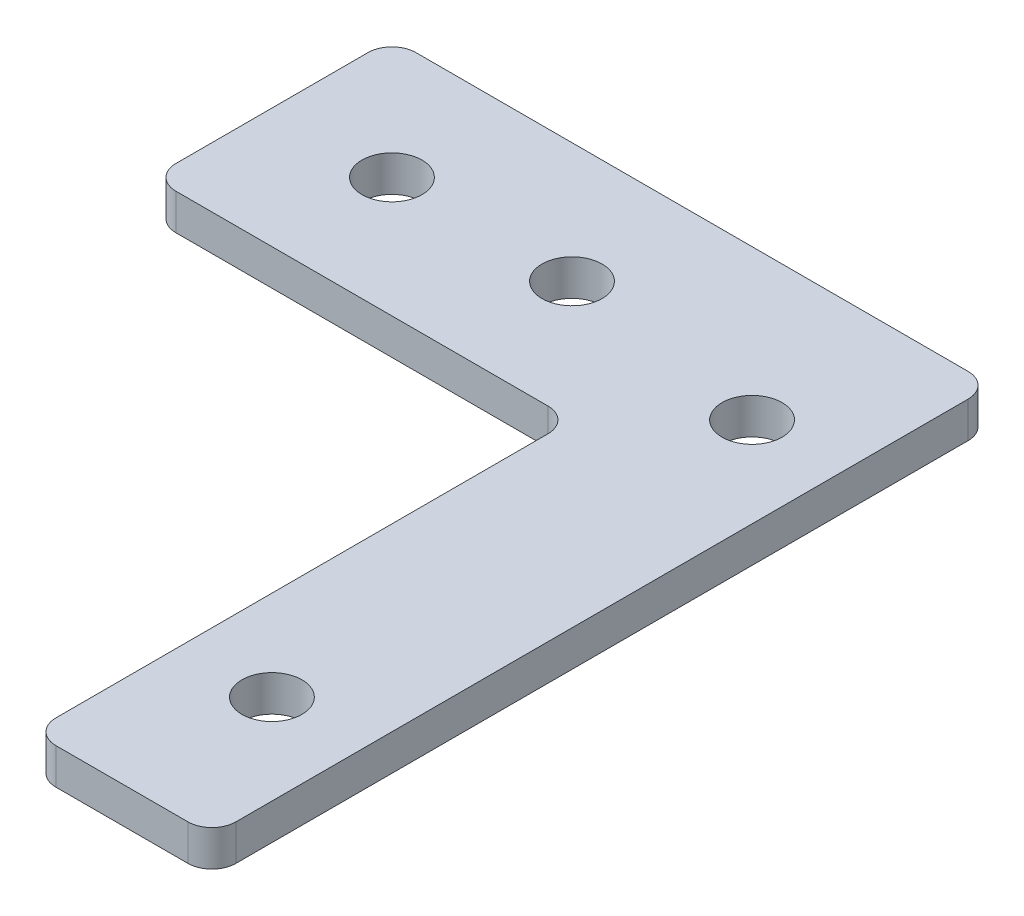
ISO-10303-21;
HEADER;
FILE_DESCRIPTION(('STEP AP214'),'2;1');
FILE_NAME('part.step','',(''),(''),'','','');
FILE_SCHEMA(('AUTOMOTIVE_DESIGN { 1 0 10303 214 1 1 1 1 }'));
ENDSEC;
DATA;
#1=APPLICATION_CONTEXT('core data for automotive mechanical design processes');
#2=APPLICATION_PROTOCOL_DEFINITION('international standard','automotive_design',2000,#1);
#3=PRODUCT_CONTEXT('',#1,'mechanical');
#4=PRODUCT('Part','Part','',(#3));
#5=PRODUCT_RELATED_PRODUCT_CATEGORY('part','',(#4));
#6=PRODUCT_DEFINITION_FORMATION('','',#4);
#7=PRODUCT_DEFINITION_CONTEXT('part definition',#1,'design');
#8=PRODUCT_DEFINITION('design','',#6,#7);
#9=PRODUCT_DEFINITION_SHAPE('','',#8);
#10=(LENGTH_UNIT() NAMED_UNIT(*) SI_UNIT(.MILLI.,.METRE.));
#11=(NAMED_UNIT(*) PLANE_ANGLE_UNIT() SI_UNIT($,.RADIAN.));
#12=(NAMED_UNIT(*) SI_UNIT($,.STERADIAN.) SOLID_ANGLE_UNIT());
#13=UNCERTAINTY_MEASURE_WITH_UNIT(LENGTH_MEASURE(1.E-05),#10,'distance_accuracy_value','');
#14=(GEOMETRIC_REPRESENTATION_CONTEXT(3) GLOBAL_UNCERTAINTY_ASSIGNED_CONTEXT((#13)) GLOBAL_UNIT_ASSIGNED_CONTEXT((#10,
#11,#12)) REPRESENTATION_CONTEXT('',''));
#15=CARTESIAN_POINT('',(0.,0.,0.));
#16=DIRECTION('',(0.,0.,1.));
#17=DIRECTION('',(1.,0.,0.));
#18=AXIS2_PLACEMENT_3D('',#15,#16,#17);
#19=CARTESIAN_POINT('',(0.,3.,-20.));
#20=DIRECTION('',(0.,0.,-1.));
#21=DIRECTION('',(-1.,0.,0.));
#22=AXIS2_PLACEMENT_3D('',#19,#20,#21);
#23=PLANE('',#22);
#24=DIRECTION('',(1.,0.,0.));
#25=VECTOR('',#24,1.);
#26=CARTESIAN_POINT('',(0.,0.,-20.));
#27=LINE('',#26,#25);
#28=CARTESIAN_POINT('',(2.00000000000001,0.,-20.));
#29=VERTEX_POINT('',#28);
#30=CARTESIAN_POINT('',(48.,0.,-20.));
#31=VERTEX_POINT('',#30);
#32=EDGE_CURVE('E167',#29,#31,#27,.T.);
#33=ORIENTED_EDGE('',*,*,#32,.F.);
#34=DIRECTION('',(0.,-1.,0.));
#35=VECTOR('',#34,1.);
#36=CARTESIAN_POINT('',(2.00000000000001,3.,-20.));
#37=LINE('',#36,#35);
#38=CARTESIAN_POINT('',(2.00000000000001,3.,-20.));
#39=VERTEX_POINT('',#38);
#40=EDGE_CURVE('E11',#39,#29,#37,.T.);
#41=ORIENTED_EDGE('',*,*,#40,.F.);
#42=DIRECTION('',(1.,0.,0.));
#43=VECTOR('',#42,1.);
#44=CARTESIAN_POINT('',(0.,3.,-20.));
#45=LINE('',#44,#43);
#46=CARTESIAN_POINT('',(48.,3.,-20.));
#47=VERTEX_POINT('',#46);
#48=EDGE_CURVE('E239',#39,#47,#45,.T.);
#49=ORIENTED_EDGE('',*,*,#48,.T.);
#50=DIRECTION('',(0.,-1.,0.));
#51=VECTOR('',#50,1.);
#52=CARTESIAN_POINT('',(48.,3.,-20.));
#53=LINE('',#52,#51);
#54=EDGE_CURVE('E100',#47,#31,#53,.T.);
#55=ORIENTED_EDGE('',*,*,#54,.T.);
#56=EDGE_LOOP('',(#33,#41,#49,#55));
#57=FACE_BOUND('',#56,.T.);
#58=ADVANCED_FACE('F37',(#57),#23,.T.);
#59=CARTESIAN_POINT('',(2.,3.,-18.));
#60=DIRECTION('',(0.,-1.,0.));
#61=DIRECTION('',(0.,0.,-1.));
#62=AXIS2_PLACEMENT_3D('',#59,#60,#61);
#63=CYLINDRICAL_SURFACE('',#62,2.);
#64=CARTESIAN_POINT('',(2.,0.,-18.));
#65=DIRECTION('',(0.,1.,0.));
#66=DIRECTION('',(0.,0.,1.));
#67=AXIS2_PLACEMENT_3D('',#64,#65,#66);
#68=CIRCLE('',#67,2.);
#69=CARTESIAN_POINT('',(0.,0.,-18.));
#70=VERTEX_POINT('',#69);
#71=EDGE_CURVE('E170',#29,#70,#68,.T.);
#72=ORIENTED_EDGE('',*,*,#71,.T.);
#73=DIRECTION('',(0.,-1.,0.));
#74=VECTOR('',#73,1.);
#75=CARTESIAN_POINT('',(0.,3.,-18.));
#76=LINE('',#75,#74);
#77=CARTESIAN_POINT('',(0.,3.,-18.));
#78=VERTEX_POINT('',#77);
#79=EDGE_CURVE('E46',#78,#70,#76,.T.);
#80=ORIENTED_EDGE('',*,*,#79,.F.);
#81=CARTESIAN_POINT('',(2.,3.,-18.));
#82=DIRECTION('',(0.,1.,0.));
#83=DIRECTION('',(0.,0.,1.));
#84=AXIS2_PLACEMENT_3D('',#81,#82,#83);
#85=CIRCLE('',#84,2.);
#86=EDGE_CURVE('E235',#39,#78,#85,.T.);
#87=ORIENTED_EDGE('',*,*,#86,.F.);
#88=ORIENTED_EDGE('',*,*,#40,.T.);
#89=EDGE_LOOP('',(#72,#80,#87,#88));
#90=FACE_BOUND('',#89,.T.);
#91=ADVANCED_FACE('F224',(#90),#63,.T.);
#92=CARTESIAN_POINT('',(0.,3.,0.));
#93=DIRECTION('',(-1.,0.,0.));
#94=DIRECTION('',(0.,0.,1.));
#95=AXIS2_PLACEMENT_3D('',#92,#93,#94);
#96=PLANE('',#95);
#97=DIRECTION('',(0.,0.,-1.));
#98=VECTOR('',#97,1.);
#99=CARTESIAN_POINT('',(0.,0.,0.));
#100=LINE('',#99,#98);
#101=CARTESIAN_POINT('',(0.,0.,-2.00000000000001));
#102=VERTEX_POINT('',#101);
#103=EDGE_CURVE('E173',#102,#70,#100,.T.);
#104=ORIENTED_EDGE('',*,*,#103,.F.);
#105=DIRECTION('',(0.,-1.,0.));
#106=VECTOR('',#105,1.);
#107=CARTESIAN_POINT('',(0.,3.,-2.00000000000001));
#108=LINE('',#107,#106);
#109=CARTESIAN_POINT('',(0.,3.,-2.00000000000001));
#110=VERTEX_POINT('',#109);
#111=EDGE_CURVE('E214',#110,#102,#108,.T.);
#112=ORIENTED_EDGE('',*,*,#111,.F.);
#113=DIRECTION('',(0.,0.,-1.));
#114=VECTOR('',#113,1.);
#115=CARTESIAN_POINT('',(0.,3.,0.));
#116=LINE('',#115,#114);
#117=EDGE_CURVE('E221',#110,#78,#116,.T.);
#118=ORIENTED_EDGE('',*,*,#117,.T.);
#119=ORIENTED_EDGE('',*,*,#79,.T.);
#120=EDGE_LOOP('',(#104,#112,#118,#119));
#121=FACE_BOUND('',#120,.T.);
#122=ADVANCED_FACE('F219',(#121),#96,.T.);
#123=CARTESIAN_POINT('',(2.,3.,-2.));
#124=DIRECTION('',(0.,-1.,0.));
#125=DIRECTION('',(0.,0.,-1.));
#126=AXIS2_PLACEMENT_3D('',#123,#124,#125);
#127=CYLINDRICAL_SURFACE('',#126,2.);
#128=CARTESIAN_POINT('',(2.,0.,-2.));
#129=DIRECTION('',(0.,1.,0.));
#130=DIRECTION('',(0.,0.,1.));
#131=AXIS2_PLACEMENT_3D('',#128,#129,#130);
#132=CIRCLE('',#131,2.);
#133=CARTESIAN_POINT('',(2.00000000000001,0.,0.));
#134=VERTEX_POINT('',#133);
#135=EDGE_CURVE('E176',#134,#102,#132,.F.);
#136=ORIENTED_EDGE('',*,*,#135,.F.);
#137=DIRECTION('',(0.,-1.,0.));
#138=VECTOR('',#137,1.);
#139=CARTESIAN_POINT('',(2.00000000000001,3.,0.));
#140=LINE('',#139,#138);
#141=CARTESIAN_POINT('',(2.00000000000001,3.,0.));
#142=VERTEX_POINT('',#141);
#143=EDGE_CURVE('E212',#142,#134,#140,.T.);
#144=ORIENTED_EDGE('',*,*,#143,.F.);
#145=CARTESIAN_POINT('',(2.,3.,-2.));
#146=DIRECTION('',(0.,1.,0.));
#147=DIRECTION('',(0.,0.,1.));
#148=AXIS2_PLACEMENT_3D('',#145,#146,#147);
#149=CIRCLE('',#148,2.);
#150=EDGE_CURVE('E234',#142,#110,#149,.F.);
#151=ORIENTED_EDGE('',*,*,#150,.T.);
#152=ORIENTED_EDGE('',*,*,#111,.T.);
#153=EDGE_LOOP('',(#136,#144,#151,#152));
#154=FACE_BOUND('',#153,.T.);
#155=ADVANCED_FACE('F230',(#154),#127,.T.);
#156=CARTESIAN_POINT('',(0.,3.,0.));
#157=DIRECTION('',(0.,0.,-1.));
#158=DIRECTION('',(-1.,0.,0.));
#159=AXIS2_PLACEMENT_3D('',#156,#157,#158);
#160=PLANE('',#159);
#161=DIRECTION('',(1.,0.,0.));
#162=VECTOR('',#161,1.);
#163=CARTESIAN_POINT('',(0.,0.,0.));
#164=LINE('',#163,#162);
#165=CARTESIAN_POINT('',(33.,0.,0.));
#166=VERTEX_POINT('',#165);
#167=EDGE_CURVE('E179',#134,#166,#164,.T.);
#168=ORIENTED_EDGE('',*,*,#167,.T.);
#169=DIRECTION('',(0.,-1.,0.));
#170=VECTOR('',#169,1.);
#171=CARTESIAN_POINT('',(33.,3.,0.));
#172=LINE('',#171,#170);
#173=CARTESIAN_POINT('',(33.,3.,0.));
#174=VERTEX_POINT('',#173);
#175=EDGE_CURVE('E210',#174,#166,#172,.T.);
#176=ORIENTED_EDGE('',*,*,#175,.F.);
#177=DIRECTION('',(1.,0.,0.));
#178=VECTOR('',#177,1.);
#179=CARTESIAN_POINT('',(0.,3.,0.));
#180=LINE('',#179,#178);
#181=EDGE_CURVE('E237',#142,#174,#180,.T.);
#182=ORIENTED_EDGE('',*,*,#181,.F.);
#183=ORIENTED_EDGE('',*,*,#143,.T.);
#184=EDGE_LOOP('',(#168,#176,#182,#183));
#185=FACE_BOUND('',#184,.T.);
#186=ADVANCED_FACE('F338',(#185),#160,.F.);
#187=CARTESIAN_POINT('',(33.,3.,2.));
#188=DIRECTION('',(0.,-1.,0.));
#189=DIRECTION('',(0.,0.,-1.));
#190=AXIS2_PLACEMENT_3D('',#187,#188,#189);
#191=CYLINDRICAL_SURFACE('',#190,2.);
#192=CARTESIAN_POINT('',(33.,0.,2.));
#193=DIRECTION('',(0.,1.,0.));
#194=DIRECTION('',(0.,0.,1.));
#195=AXIS2_PLACEMENT_3D('',#192,#193,#194);
#196=CIRCLE('',#195,2.);
#197=CARTESIAN_POINT('',(35.,0.,2.00000000000002));
#198=VERTEX_POINT('',#197);
#199=EDGE_CURVE('E182',#198,#166,#196,.T.);
#200=ORIENTED_EDGE('',*,*,#199,.F.);
#201=DIRECTION('',(0.,-1.,0.));
#202=VECTOR('',#201,1.);
#203=CARTESIAN_POINT('',(35.,3.,2.00000000000002));
#204=LINE('',#203,#202);
#205=CARTESIAN_POINT('',(35.,3.,2.00000000000002));
#206=VERTEX_POINT('',#205);
#207=EDGE_CURVE('E208',#206,#198,#204,.T.);
#208=ORIENTED_EDGE('',*,*,#207,.F.);
#209=CARTESIAN_POINT('',(33.,3.,2.));
#210=DIRECTION('',(0.,1.,0.));
#211=DIRECTION('',(0.,0.,1.));
#212=AXIS2_PLACEMENT_3D('',#209,#210,#211);
#213=CIRCLE('',#212,2.);
#214=EDGE_CURVE('E244',#206,#174,#213,.T.);
#215=ORIENTED_EDGE('',*,*,#214,.T.);
#216=ORIENTED_EDGE('',*,*,#175,.T.);
#217=EDGE_LOOP('',(#200,#208,#215,#216));
#218=FACE_BOUND('',#217,.T.);
#219=ADVANCED_FACE('F334',(#218),#191,.F.);
#220=CARTESIAN_POINT('',(35.,3.,0.));
#221=DIRECTION('',(1.,0.,0.));
#222=DIRECTION('',(0.,0.,-1.));
#223=AXIS2_PLACEMENT_3D('',#220,#221,#222);
#224=PLANE('',#223);
#225=DIRECTION('',(0.,0.,1.));
#226=VECTOR('',#225,1.);
#227=CARTESIAN_POINT('',(35.,0.,0.));
#228=LINE('',#227,#226);
#229=CARTESIAN_POINT('',(35.,0.,43.));
#230=VERTEX_POINT('',#229);
#231=EDGE_CURVE('E185',#198,#230,#228,.T.);
#232=ORIENTED_EDGE('',*,*,#231,.T.);
#233=DIRECTION('',(0.,-1.,0.));
#234=VECTOR('',#233,1.);
#235=CARTESIAN_POINT('',(35.,3.,43.));
#236=LINE('',#235,#234);
#237=CARTESIAN_POINT('',(35.,3.,43.));
#238=VERTEX_POINT('',#237);
#239=EDGE_CURVE('E205',#238,#230,#236,.T.);
#240=ORIENTED_EDGE('',*,*,#239,.F.);
#241=DIRECTION('',(0.,0.,1.));
#242=VECTOR('',#241,1.);
#243=CARTESIAN_POINT('',(35.,3.,0.));
#244=LINE('',#243,#242);
#245=EDGE_CURVE('E247',#206,#238,#244,.T.);
#246=ORIENTED_EDGE('',*,*,#245,.F.);
#247=ORIENTED_EDGE('',*,*,#207,.T.);
#248=EDGE_LOOP('',(#232,#240,#246,#247));
#249=FACE_BOUND('',#248,.T.);
#250=ADVANCED_FACE('F330',(#249),#224,.F.);
#251=CARTESIAN_POINT('',(37.,3.,43.));
#252=DIRECTION('',(0.,-1.,0.));
#253=DIRECTION('',(0.,0.,-1.));
#254=AXIS2_PLACEMENT_3D('',#251,#252,#253);
#255=CYLINDRICAL_SURFACE('',#254,1.99999999999999);
#256=CARTESIAN_POINT('',(37.,0.,43.));
#257=DIRECTION('',(0.,1.,0.));
#258=DIRECTION('',(0.,0.,1.));
#259=AXIS2_PLACEMENT_3D('',#256,#257,#258);
#260=CIRCLE('',#259,1.99999999999999);
#261=CARTESIAN_POINT('',(37.,0.,45.));
#262=VERTEX_POINT('',#261);
#263=EDGE_CURVE('E188',#230,#262,#260,.T.);
#264=ORIENTED_EDGE('',*,*,#263,.T.);
#265=DIRECTION('',(0.,-1.,0.));
#266=VECTOR('',#265,1.);
#267=CARTESIAN_POINT('',(37.,3.,45.));
#268=LINE('',#267,#266);
#269=CARTESIAN_POINT('',(37.,3.,45.));
#270=VERTEX_POINT('',#269);
#271=EDGE_CURVE('E203',#270,#262,#268,.T.);
#272=ORIENTED_EDGE('',*,*,#271,.F.);
#273=CARTESIAN_POINT('',(37.,3.,43.));
#274=DIRECTION('',(0.,1.,0.));
#275=DIRECTION('',(0.,0.,1.));
#276=AXIS2_PLACEMENT_3D('',#273,#274,#275);
#277=CIRCLE('',#276,1.99999999999999);
#278=EDGE_CURVE('E250',#238,#270,#277,.T.);
#279=ORIENTED_EDGE('',*,*,#278,.F.);
#280=ORIENTED_EDGE('',*,*,#239,.T.);
#281=EDGE_LOOP('',(#264,#272,#279,#280));
#282=FACE_BOUND('',#281,.T.);
#283=ADVANCED_FACE('F327',(#282),#255,.T.);
#284=CARTESIAN_POINT('',(0.,3.,45.));
#285=DIRECTION('',(0.,0.,1.));
#286=DIRECTION('',(1.,0.,0.));
#287=AXIS2_PLACEMENT_3D('',#284,#285,#286);
#288=PLANE('',#287);
#289=DIRECTION('',(-1.,0.,0.));
#290=VECTOR('',#289,1.);
#291=CARTESIAN_POINT('',(0.,0.,45.));
#292=LINE('',#291,#290);
#293=CARTESIAN_POINT('',(48.,0.,45.));
#294=VERTEX_POINT('',#293);
#295=EDGE_CURVE('E191',#294,#262,#292,.T.);
#296=ORIENTED_EDGE('',*,*,#295,.F.);
#297=DIRECTION('',(0.,-1.,0.));
#298=VECTOR('',#297,1.);
#299=CARTESIAN_POINT('',(48.,3.,45.));
#300=LINE('',#299,#298);
#301=CARTESIAN_POINT('',(48.,3.,45.));
#302=VERTEX_POINT('',#301);
#303=EDGE_CURVE('E148',#302,#294,#300,.T.);
#304=ORIENTED_EDGE('',*,*,#303,.F.);
#305=DIRECTION('',(-1.,0.,0.));
#306=VECTOR('',#305,1.);
#307=CARTESIAN_POINT('',(0.,3.,45.));
#308=LINE('',#307,#306);
#309=EDGE_CURVE('E137',#302,#270,#308,.T.);
#310=ORIENTED_EDGE('',*,*,#309,.T.);
#311=ORIENTED_EDGE('',*,*,#271,.T.);
#312=EDGE_LOOP('',(#296,#304,#310,#311));
#313=FACE_BOUND('',#312,.T.);
#314=ADVANCED_FACE('F253',(#313),#288,.T.);
#315=CARTESIAN_POINT('',(48.,3.,43.));
#316=DIRECTION('',(0.,-1.,0.));
#317=DIRECTION('',(0.,0.,-1.));
#318=AXIS2_PLACEMENT_3D('',#315,#316,#317);
#319=CYLINDRICAL_SURFACE('',#318,2.);
#320=CARTESIAN_POINT('',(48.,0.,43.));
#321=DIRECTION('',(0.,1.,0.));
#322=DIRECTION('',(0.,0.,1.));
#323=AXIS2_PLACEMENT_3D('',#320,#321,#322);
#324=CIRCLE('',#323,2.);
#325=CARTESIAN_POINT('',(50.,0.,43.));
#326=VERTEX_POINT('',#325);
#327=EDGE_CURVE('E144',#294,#326,#324,.T.);
#328=ORIENTED_EDGE('',*,*,#327,.T.);
#329=DIRECTION('',(0.,-1.,0.));
#330=VECTOR('',#329,1.);
#331=CARTESIAN_POINT('',(50.,3.,43.));
#332=LINE('',#331,#330);
#333=CARTESIAN_POINT('',(50.,3.,43.));
#334=VERTEX_POINT('',#333);
#335=EDGE_CURVE('E141',#334,#326,#332,.T.);
#336=ORIENTED_EDGE('',*,*,#335,.F.);
#337=CARTESIAN_POINT('',(48.,3.,43.));
#338=DIRECTION('',(0.,1.,0.));
#339=DIRECTION('',(0.,0.,1.));
#340=AXIS2_PLACEMENT_3D('',#337,#338,#339);
#341=CIRCLE('',#340,2.);
#342=EDGE_CURVE('E131',#302,#334,#341,.T.);
#343=ORIENTED_EDGE('',*,*,#342,.F.);
#344=ORIENTED_EDGE('',*,*,#303,.T.);
#345=EDGE_LOOP('',(#328,#336,#343,#344));
#346=FACE_BOUND('',#345,.T.);
#347=ADVANCED_FACE('F142',(#346),#319,.T.);
#348=CARTESIAN_POINT('',(50.,3.,0.));
#349=DIRECTION('',(1.,0.,0.));
#350=DIRECTION('',(0.,0.,-1.));
#351=AXIS2_PLACEMENT_3D('',#348,#349,#350);
#352=PLANE('',#351);
#353=DIRECTION('',(0.,0.,1.));
#354=VECTOR('',#353,1.);
#355=CARTESIAN_POINT('',(50.,0.,0.));
#356=LINE('',#355,#354);
#357=CARTESIAN_POINT('',(50.,0.,-18.));
#358=VERTEX_POINT('',#357);
#359=EDGE_CURVE('E195',#358,#326,#356,.T.);
#360=ORIENTED_EDGE('',*,*,#359,.F.);
#361=DIRECTION('',(0.,-1.,0.));
#362=VECTOR('',#361,1.);
#363=CARTESIAN_POINT('',(50.,3.,-18.));
#364=LINE('',#363,#362);
#365=CARTESIAN_POINT('',(50.,3.,-18.));
#366=VERTEX_POINT('',#365);
#367=EDGE_CURVE('E93',#366,#358,#364,.T.);
#368=ORIENTED_EDGE('',*,*,#367,.F.);
#369=DIRECTION('',(0.,0.,1.));
#370=VECTOR('',#369,1.);
#371=CARTESIAN_POINT('',(50.,3.,0.));
#372=LINE('',#371,#370);
#373=EDGE_CURVE('E135',#366,#334,#372,.T.);
#374=ORIENTED_EDGE('',*,*,#373,.T.);
#375=ORIENTED_EDGE('',*,*,#335,.T.);
#376=EDGE_LOOP('',(#360,#368,#374,#375));
#377=FACE_BOUND('',#376,.T.);
#378=ADVANCED_FACE('F150',(#377),#352,.T.);
#379=CARTESIAN_POINT('',(25.,3.,-10.));
#380=DIRECTION('',(0.,-1.,0.));
#381=DIRECTION('',(0.,0.,-1.));
#382=AXIS2_PLACEMENT_3D('',#379,#380,#381);
#383=CYLINDRICAL_SURFACE('',#382,2.5);
#384=CARTESIAN_POINT('',(25.,3.,-10.));
#385=DIRECTION('',(0.,1.,0.));
#386=DIRECTION('',(0.,0.,1.));
#387=AXIS2_PLACEMENT_3D('',#384,#385,#386);
#388=CIRCLE('',#387,2.5);
#389=CARTESIAN_POINT('',(25.,3.,-7.5));
#390=VERTEX_POINT('',#389);
#391=EDGE_CURVE('E256',#390,#390,#388,.T.);
#392=ORIENTED_EDGE('',*,*,#391,.T.);
#393=EDGE_LOOP('',(#392));
#394=FACE_BOUND('',#393,.T.);
#395=CARTESIAN_POINT('',(25.,0.,-10.));
#396=DIRECTION('',(0.,1.,0.));
#397=DIRECTION('',(0.,0.,1.));
#398=AXIS2_PLACEMENT_3D('',#395,#396,#397);
#399=CIRCLE('',#398,2.5);
#400=CARTESIAN_POINT('',(25.,0.,-7.5));
#401=VERTEX_POINT('',#400);
#402=EDGE_CURVE('E164',#401,#401,#399,.T.);
#403=ORIENTED_EDGE('',*,*,#402,.F.);
#404=EDGE_LOOP('',(#403));
#405=FACE_BOUND('',#404,.T.);
#406=ADVANCED_FACE('F280',(#394,#405),#383,.F.);
#407=CARTESIAN_POINT('',(10.,3.,-10.));
#408=DIRECTION('',(0.,-1.,0.));
#409=DIRECTION('',(0.,0.,-1.));
#410=AXIS2_PLACEMENT_3D('',#407,#408,#409);
#411=CYLINDRICAL_SURFACE('',#410,2.5);
#412=CARTESIAN_POINT('',(10.,3.,-10.));
#413=DIRECTION('',(0.,1.,0.));
#414=DIRECTION('',(0.,0.,1.));
#415=AXIS2_PLACEMENT_3D('',#412,#413,#414);
#416=CIRCLE('',#415,2.5);
#417=CARTESIAN_POINT('',(10.,3.,-7.5));
#418=VERTEX_POINT('',#417);
#419=EDGE_CURVE('E258',#418,#418,#416,.T.);
#420=ORIENTED_EDGE('',*,*,#419,.T.);
#421=EDGE_LOOP('',(#420));
#422=FACE_BOUND('',#421,.T.);
#423=CARTESIAN_POINT('',(10.,0.,-10.));
#424=DIRECTION('',(0.,1.,0.));
#425=DIRECTION('',(0.,0.,1.));
#426=AXIS2_PLACEMENT_3D('',#423,#424,#425);
#427=CIRCLE('',#426,2.5);
#428=CARTESIAN_POINT('',(10.,0.,-7.5));
#429=VERTEX_POINT('',#428);
#430=EDGE_CURVE('E161',#429,#429,#427,.T.);
#431=ORIENTED_EDGE('',*,*,#430,.F.);
#432=EDGE_LOOP('',(#431));
#433=FACE_BOUND('',#432,.T.);
#434=ADVANCED_FACE('F283',(#422,#433),#411,.F.);
#435=CARTESIAN_POINT('',(42.5,3.,32.5));
#436=DIRECTION('',(0.,-1.,0.));
#437=DIRECTION('',(0.,0.,-1.));
#438=AXIS2_PLACEMENT_3D('',#435,#436,#437);
#439=CYLINDRICAL_SURFACE('',#438,2.5);
#440=CARTESIAN_POINT('',(42.5,3.,32.5));
#441=DIRECTION('',(0.,1.,0.));
#442=DIRECTION('',(0.,0.,1.));
#443=AXIS2_PLACEMENT_3D('',#440,#441,#442);
#444=CIRCLE('',#443,2.5);
#445=CARTESIAN_POINT('',(42.5,3.,35.));
#446=VERTEX_POINT('',#445);
#447=EDGE_CURVE('E263',#446,#446,#444,.T.);
#448=ORIENTED_EDGE('',*,*,#447,.T.);
#449=EDGE_LOOP('',(#448));
#450=FACE_BOUND('',#449,.T.);
#451=CARTESIAN_POINT('',(42.5,0.,32.5));
#452=DIRECTION('',(0.,1.,0.));
#453=DIRECTION('',(0.,0.,1.));
#454=AXIS2_PLACEMENT_3D('',#451,#452,#453);
#455=CIRCLE('',#454,2.5);
#456=CARTESIAN_POINT('',(42.5,0.,35.));
#457=VERTEX_POINT('',#456);
#458=EDGE_CURVE('E158',#457,#457,#455,.T.);
#459=ORIENTED_EDGE('',*,*,#458,.F.);
#460=EDGE_LOOP('',(#459));
#461=FACE_BOUND('',#460,.T.);
#462=ADVANCED_FACE('F303',(#450,#461),#439,.F.);
#463=CARTESIAN_POINT('',(42.5,3.,-7.5));
#464=DIRECTION('',(0.,-1.,0.));
#465=DIRECTION('',(0.,0.,-1.));
#466=AXIS2_PLACEMENT_3D('',#463,#464,#465);
#467=CYLINDRICAL_SURFACE('',#466,2.5);
#468=CARTESIAN_POINT('',(42.5,3.,-7.5));
#469=DIRECTION('',(0.,1.,0.));
#470=DIRECTION('',(0.,0.,1.));
#471=AXIS2_PLACEMENT_3D('',#468,#469,#470);
#472=CIRCLE('',#471,2.5);
#473=CARTESIAN_POINT('',(42.5,3.,-5.));
#474=VERTEX_POINT('',#473);
#475=EDGE_CURVE('E199',#474,#474,#472,.T.);
#476=ORIENTED_EDGE('',*,*,#475,.T.);
#477=EDGE_LOOP('',(#476));
#478=FACE_BOUND('',#477,.T.);
#479=CARTESIAN_POINT('',(42.5,0.,-7.5));
#480=DIRECTION('',(0.,1.,0.));
#481=DIRECTION('',(0.,0.,1.));
#482=AXIS2_PLACEMENT_3D('',#479,#480,#481);
#483=CIRCLE('',#482,2.5);
#484=CARTESIAN_POINT('',(42.5,0.,-5.));
#485=VERTEX_POINT('',#484);
#486=EDGE_CURVE('E155',#485,#485,#483,.T.);
#487=ORIENTED_EDGE('',*,*,#486,.F.);
#488=EDGE_LOOP('',(#487));
#489=FACE_BOUND('',#488,.T.);
#490=ADVANCED_FACE('F39',(#478,#489),#467,.F.);
#491=CARTESIAN_POINT('',(48.,3.,-18.));
#492=DIRECTION('',(0.,-1.,0.));
#493=DIRECTION('',(0.,0.,-1.));
#494=AXIS2_PLACEMENT_3D('',#491,#492,#493);
#495=CYLINDRICAL_SURFACE('',#494,2.);
#496=CARTESIAN_POINT('',(48.,0.,-18.));
#497=DIRECTION('',(0.,1.,0.));
#498=DIRECTION('',(0.,0.,1.));
#499=AXIS2_PLACEMENT_3D('',#496,#497,#498);
#500=CIRCLE('',#499,2.);
#501=EDGE_CURVE('E197',#358,#31,#500,.T.);
#502=ORIENTED_EDGE('',*,*,#501,.T.);
#503=ORIENTED_EDGE('',*,*,#54,.F.);
#504=CARTESIAN_POINT('',(48.,3.,-18.));
#505=DIRECTION('',(0.,1.,0.));
#506=DIRECTION('',(0.,0.,1.));
#507=AXIS2_PLACEMENT_3D('',#504,#505,#506);
#508=CIRCLE('',#507,2.);
#509=EDGE_CURVE('E54',#366,#47,#508,.T.);
#510=ORIENTED_EDGE('',*,*,#509,.F.);
#511=ORIENTED_EDGE('',*,*,#367,.T.);
#512=EDGE_LOOP('',(#502,#503,#510,#511));
#513=FACE_BOUND('',#512,.T.);
#514=ADVANCED_FACE('F255',(#513),#495,.T.);
#515=CARTESIAN_POINT('',(0.,3.,0.));
#516=DIRECTION('',(0.,1.,0.));
#517=DIRECTION('',(0.,0.,1.));
#518=AXIS2_PLACEMENT_3D('',#515,#516,#517);
#519=PLANE('',#518);
#520=ORIENTED_EDGE('',*,*,#475,.F.);
#521=EDGE_LOOP('',(#520));
#522=FACE_BOUND('',#521,.T.);
#523=ORIENTED_EDGE('',*,*,#447,.F.);
#524=EDGE_LOOP('',(#523));
#525=FACE_BOUND('',#524,.T.);
#526=ORIENTED_EDGE('',*,*,#419,.F.);
#527=EDGE_LOOP('',(#526));
#528=FACE_BOUND('',#527,.T.);
#529=ORIENTED_EDGE('',*,*,#391,.F.);
#530=EDGE_LOOP('',(#529));
#531=FACE_BOUND('',#530,.T.);
#532=ORIENTED_EDGE('',*,*,#48,.F.);
#533=ORIENTED_EDGE('',*,*,#86,.T.);
#534=ORIENTED_EDGE('',*,*,#117,.F.);
#535=ORIENTED_EDGE('',*,*,#150,.F.);
#536=ORIENTED_EDGE('',*,*,#181,.T.);
#537=ORIENTED_EDGE('',*,*,#214,.F.);
#538=ORIENTED_EDGE('',*,*,#245,.T.);
#539=ORIENTED_EDGE('',*,*,#278,.T.);
#540=ORIENTED_EDGE('',*,*,#309,.F.);
#541=ORIENTED_EDGE('',*,*,#342,.T.);
#542=ORIENTED_EDGE('',*,*,#373,.F.);
#543=ORIENTED_EDGE('',*,*,#509,.T.);
#544=EDGE_LOOP('',(#532,#533,#534,#535,#536,#537,#538,#539,#540,#541,#542,#543));
#545=FACE_BOUND('',#544,.T.);
#546=ADVANCED_FACE('F133',(#522,#525,#528,#531,#545),#519,.T.);
#547=CARTESIAN_POINT('',(0.,0.,0.));
#548=DIRECTION('',(0.,1.,0.));
#549=DIRECTION('',(0.,0.,1.));
#550=AXIS2_PLACEMENT_3D('',#547,#548,#549);
#551=PLANE('',#550);
#552=ORIENTED_EDGE('',*,*,#486,.T.);
#553=EDGE_LOOP('',(#552));
#554=FACE_BOUND('',#553,.T.);
#555=ORIENTED_EDGE('',*,*,#458,.T.);
#556=EDGE_LOOP('',(#555));
#557=FACE_BOUND('',#556,.T.);
#558=ORIENTED_EDGE('',*,*,#430,.T.);
#559=EDGE_LOOP('',(#558));
#560=FACE_BOUND('',#559,.T.);
#561=ORIENTED_EDGE('',*,*,#402,.T.);
#562=EDGE_LOOP('',(#561));
#563=FACE_BOUND('',#562,.T.);
#564=ORIENTED_EDGE('',*,*,#32,.T.);
#565=ORIENTED_EDGE('',*,*,#501,.F.);
#566=ORIENTED_EDGE('',*,*,#359,.T.);
#567=ORIENTED_EDGE('',*,*,#327,.F.);
#568=ORIENTED_EDGE('',*,*,#295,.T.);
#569=ORIENTED_EDGE('',*,*,#263,.F.);
#570=ORIENTED_EDGE('',*,*,#231,.F.);
#571=ORIENTED_EDGE('',*,*,#199,.T.);
#572=ORIENTED_EDGE('',*,*,#167,.F.);
#573=ORIENTED_EDGE('',*,*,#135,.T.);
#574=ORIENTED_EDGE('',*,*,#103,.T.);
#575=ORIENTED_EDGE('',*,*,#71,.F.);
#576=EDGE_LOOP('',(#564,#565,#566,#567,#568,#569,#570,#571,#572,#573,#574,#575));
#577=FACE_BOUND('',#576,.T.);
#578=ADVANCED_FACE('F226',(#554,#557,#560,#563,#577),#551,.F.);
#579=CLOSED_SHELL('',(#58,#91,#122,#155,#186,#219,#250,#283,#314,#347,#378,#406,#434,#462,#490,
#514,#546,#578));
#580=MANIFOLD_SOLID_BREP('B2',#579);
#581=ADVANCED_BREP_SHAPE_REPRESENTATION('',(#18,#580),#14);
#582=SHAPE_DEFINITION_REPRESENTATION(#9,#581);
ENDSEC;
END-ISO-10303-21;
